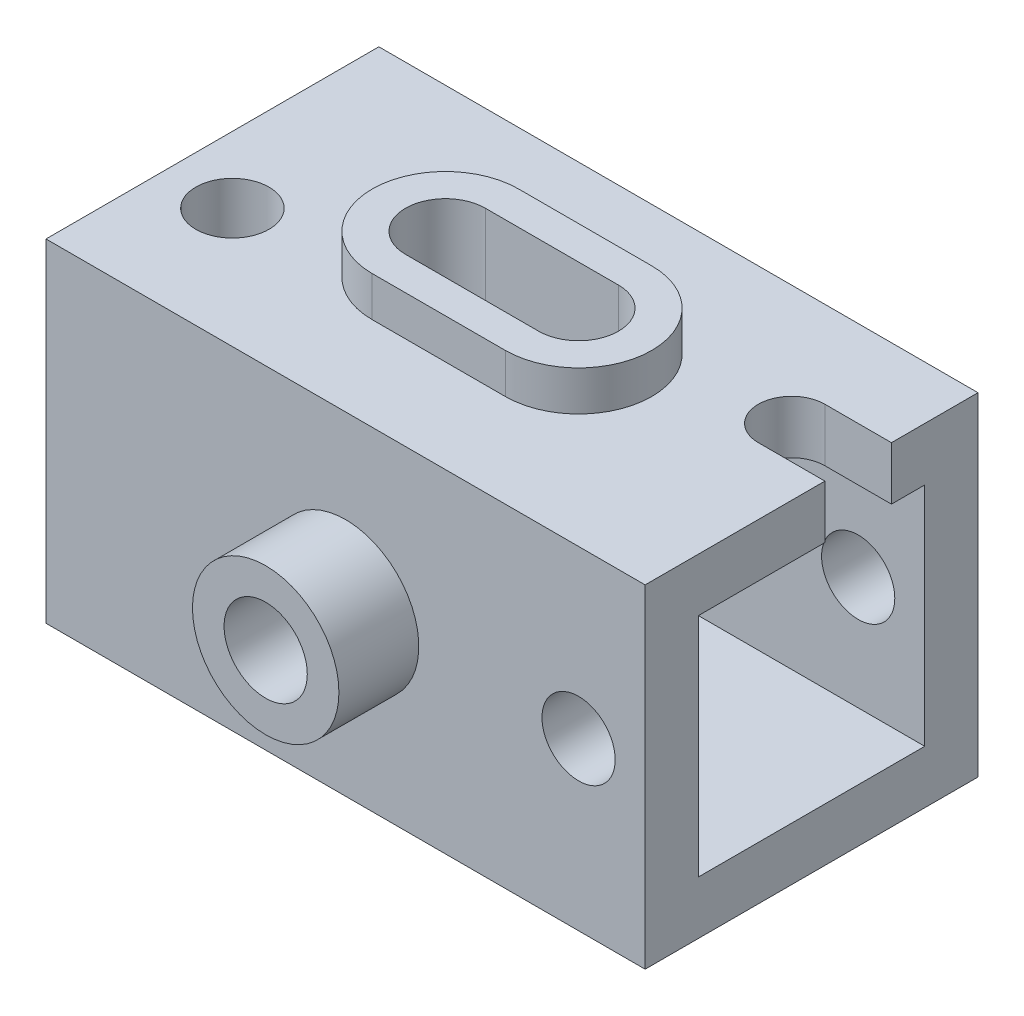
ISO-10303-21;
HEADER;
FILE_DESCRIPTION(('STEP AP214'),'2;1');
FILE_NAME('part.step','',(''),(''),'','','');
FILE_SCHEMA(('AUTOMOTIVE_DESIGN { 1 0 10303 214 1 1 1 1 }'));
ENDSEC;
DATA;
#1=APPLICATION_CONTEXT('core data for automotive mechanical design processes');
#2=APPLICATION_PROTOCOL_DEFINITION('international standard','automotive_design',2000,#1);
#3=PRODUCT_CONTEXT('',#1,'mechanical');
#4=PRODUCT('Part','Part','',(#3));
#5=PRODUCT_RELATED_PRODUCT_CATEGORY('part','',(#4));
#6=PRODUCT_DEFINITION_FORMATION('','',#4);
#7=PRODUCT_DEFINITION_CONTEXT('part definition',#1,'design');
#8=PRODUCT_DEFINITION('design','',#6,#7);
#9=PRODUCT_DEFINITION_SHAPE('','',#8);
#10=(LENGTH_UNIT() NAMED_UNIT(*) SI_UNIT(.MILLI.,.METRE.));
#11=(NAMED_UNIT(*) PLANE_ANGLE_UNIT() SI_UNIT($,.RADIAN.));
#12=(NAMED_UNIT(*) SI_UNIT($,.STERADIAN.) SOLID_ANGLE_UNIT());
#13=UNCERTAINTY_MEASURE_WITH_UNIT(LENGTH_MEASURE(1.E-05),#10,'distance_accuracy_value','');
#14=(GEOMETRIC_REPRESENTATION_CONTEXT(3) GLOBAL_UNCERTAINTY_ASSIGNED_CONTEXT((#13)) GLOBAL_UNIT_ASSIGNED_CONTEXT((#10,
#11,#12)) REPRESENTATION_CONTEXT('',''));
#15=CARTESIAN_POINT('',(0.,0.,0.));
#16=DIRECTION('',(0.,0.,1.));
#17=DIRECTION('',(1.,0.,0.));
#18=AXIS2_PLACEMENT_3D('',#15,#16,#17);
#19=CARTESIAN_POINT('',(45.,25.,-25.));
#20=DIRECTION('',(0.,-1.,0.));
#21=DIRECTION('',(0.,0.,-1.));
#22=AXIS2_PLACEMENT_3D('',#19,#20,#21);
#23=PLANE('',#22);
#24=DIRECTION('',(0.,0.,1.));
#25=VECTOR('',#24,1.);
#26=CARTESIAN_POINT('',(45.,25.,-25.));
#27=LINE('',#26,#25);
#28=CARTESIAN_POINT('',(45.,25.,-1.99999999999992));
#29=VERTEX_POINT('',#28);
#30=CARTESIAN_POINT('',(45.,25.,25.));
#31=VERTEX_POINT('',#30);
#32=EDGE_CURVE('E469',#29,#31,#27,.T.);
#33=ORIENTED_EDGE('',*,*,#32,.F.);
#34=DIRECTION('',(1.,0.,0.));
#35=VECTOR('',#34,1.);
#36=CARTESIAN_POINT('',(35.,25.,-1.99999999999991));
#37=LINE('',#36,#35);
#38=CARTESIAN_POINT('',(35.,25.,-2.));
#39=VERTEX_POINT('',#38);
#40=EDGE_CURVE('E339',#39,#29,#37,.T.);
#41=ORIENTED_EDGE('',*,*,#40,.F.);
#42=CARTESIAN_POINT('',(35.,25.,-6.99999999999999));
#43=DIRECTION('',(0.,1.,0.));
#44=DIRECTION('',(0.,0.,1.));
#45=AXIS2_PLACEMENT_3D('',#42,#43,#44);
#46=CIRCLE('',#45,4.99999999999999);
#47=CARTESIAN_POINT('',(35.,25.,-12.));
#48=VERTEX_POINT('',#47);
#49=EDGE_CURVE('E338',#48,#39,#46,.T.);
#50=ORIENTED_EDGE('',*,*,#49,.F.);
#51=DIRECTION('',(1.,0.,0.));
#52=VECTOR('',#51,1.);
#53=CARTESIAN_POINT('',(35.,25.,-12.));
#54=LINE('',#53,#52);
#55=CARTESIAN_POINT('',(45.,25.,-12.));
#56=VERTEX_POINT('',#55);
#57=EDGE_CURVE('E328',#48,#56,#54,.T.);
#58=ORIENTED_EDGE('',*,*,#57,.T.);
#59=CARTESIAN_POINT('',(45.,25.,-25.));
#60=VERTEX_POINT('',#59);
#61=EDGE_CURVE('E470',#60,#56,#27,.T.);
#62=ORIENTED_EDGE('',*,*,#61,.F.);
#63=DIRECTION('',(-1.,0.,0.));
#64=VECTOR('',#63,1.);
#65=CARTESIAN_POINT('',(45.,25.,-25.));
#66=LINE('',#65,#64);
#67=CARTESIAN_POINT('',(-45.,25.,-25.));
#68=VERTEX_POINT('',#67);
#69=EDGE_CURVE('E482',#60,#68,#66,.T.);
#70=ORIENTED_EDGE('',*,*,#69,.T.);
#71=DIRECTION('',(0.,0.,1.));
#72=VECTOR('',#71,1.);
#73=CARTESIAN_POINT('',(-45.,25.,-25.));
#74=LINE('',#73,#72);
#75=CARTESIAN_POINT('',(-45.,25.,25.));
#76=VERTEX_POINT('',#75);
#77=EDGE_CURVE('E465',#68,#76,#74,.T.);
#78=ORIENTED_EDGE('',*,*,#77,.T.);
#79=DIRECTION('',(-1.,0.,0.));
#80=VECTOR('',#79,1.);
#81=CARTESIAN_POINT('',(45.,25.,25.));
#82=LINE('',#81,#80);
#83=EDGE_CURVE('E472',#31,#76,#82,.T.);
#84=ORIENTED_EDGE('',*,*,#83,.F.);
#85=EDGE_LOOP('',(#33,#41,#50,#58,#62,#70,#78,#84));
#86=FACE_BOUND('',#85,.T.);
#87=CARTESIAN_POINT('',(-10.,25.,0.));
#88=DIRECTION('',(0.,1.,0.));
#89=DIRECTION('',(0.,0.,1.));
#90=AXIS2_PLACEMENT_3D('',#87,#88,#89);
#91=CIRCLE('',#90,11.);
#92=CARTESIAN_POINT('',(-10.,25.,-11.));
#93=VERTEX_POINT('',#92);
#94=CARTESIAN_POINT('',(-10.,25.,11.));
#95=VERTEX_POINT('',#94);
#96=EDGE_CURVE('E410',#93,#95,#91,.T.);
#97=ORIENTED_EDGE('',*,*,#96,.F.);
#98=DIRECTION('',(-1.,0.,0.));
#99=VECTOR('',#98,1.);
#100=CARTESIAN_POINT('',(-10.,25.,-11.));
#101=LINE('',#100,#99);
#102=CARTESIAN_POINT('',(10.,25.,-11.));
#103=VERTEX_POINT('',#102);
#104=EDGE_CURVE('E421',#103,#93,#101,.T.);
#105=ORIENTED_EDGE('',*,*,#104,.F.);
#106=CARTESIAN_POINT('',(10.,25.,0.));
#107=DIRECTION('',(0.,1.,0.));
#108=DIRECTION('',(0.,0.,1.));
#109=AXIS2_PLACEMENT_3D('',#106,#107,#108);
#110=CIRCLE('',#109,11.);
#111=CARTESIAN_POINT('',(10.,25.,11.));
#112=VERTEX_POINT('',#111);
#113=EDGE_CURVE('E433',#112,#103,#110,.T.);
#114=ORIENTED_EDGE('',*,*,#113,.F.);
#115=DIRECTION('',(1.,0.,0.));
#116=VECTOR('',#115,1.);
#117=CARTESIAN_POINT('',(-10.,25.,11.));
#118=LINE('',#117,#116);
#119=EDGE_CURVE('E430',#95,#112,#118,.T.);
#120=ORIENTED_EDGE('',*,*,#119,.F.);
#121=EDGE_LOOP('',(#97,#105,#114,#120));
#122=FACE_BOUND('',#121,.T.);
#123=CARTESIAN_POINT('',(-35.,25.,7.00000000000001));
#124=DIRECTION('',(0.,1.,0.));
#125=DIRECTION('',(0.,0.,1.));
#126=AXIS2_PLACEMENT_3D('',#123,#124,#125);
#127=CIRCLE('',#126,5.49999999999999);
#128=CARTESIAN_POINT('',(-35.,25.,12.5));
#129=VERTEX_POINT('',#128);
#130=EDGE_CURVE('E534',#129,#129,#127,.T.);
#131=ORIENTED_EDGE('',*,*,#130,.F.);
#132=EDGE_LOOP('',(#131));
#133=FACE_BOUND('',#132,.T.);
#134=ADVANCED_FACE('F189',(#86,#122,#133),#23,.F.);
#135=CARTESIAN_POINT('',(45.,-25.,25.));
#136=DIRECTION('',(0.,0.,-1.));
#137=DIRECTION('',(-1.,0.,0.));
#138=AXIS2_PLACEMENT_3D('',#135,#136,#137);
#139=PLANE('',#138);
#140=CARTESIAN_POINT('',(35.,0.,25.));
#141=DIRECTION('',(0.,0.,1.));
#142=DIRECTION('',(1.,0.,0.));
#143=AXIS2_PLACEMENT_3D('',#140,#141,#142);
#144=CIRCLE('',#143,5.49999999999998);
#145=CARTESIAN_POINT('',(40.5,0.,25.));
#146=VERTEX_POINT('',#145);
#147=EDGE_CURVE('E545',#146,#146,#144,.T.);
#148=ORIENTED_EDGE('',*,*,#147,.F.);
#149=EDGE_LOOP('',(#148));
#150=FACE_BOUND('',#149,.T.);
#151=CARTESIAN_POINT('',(0.,0.,25.));
#152=DIRECTION('',(0.,0.,-1.));
#153=DIRECTION('',(-1.,0.,0.));
#154=AXIS2_PLACEMENT_3D('',#151,#152,#153);
#155=CIRCLE('',#154,11.);
#156=CARTESIAN_POINT('',(-11.,0.,25.));
#157=VERTEX_POINT('',#156);
#158=EDGE_CURVE('E456',#157,#157,#155,.F.);
#159=ORIENTED_EDGE('',*,*,#158,.F.);
#160=EDGE_LOOP('',(#159));
#161=FACE_BOUND('',#160,.T.);
#162=DIRECTION('',(0.,-1.,0.));
#163=VECTOR('',#162,1.);
#164=CARTESIAN_POINT('',(-45.,-25.,25.));
#165=LINE('',#164,#163);
#166=CARTESIAN_POINT('',(-45.,-25.,25.));
#167=VERTEX_POINT('',#166);
#168=EDGE_CURVE('E453',#76,#167,#165,.T.);
#169=ORIENTED_EDGE('',*,*,#168,.T.);
#170=DIRECTION('',(-1.,0.,0.));
#171=VECTOR('',#170,1.);
#172=CARTESIAN_POINT('',(45.,-25.,25.));
#173=LINE('',#172,#171);
#174=CARTESIAN_POINT('',(45.,-25.,25.));
#175=VERTEX_POINT('',#174);
#176=EDGE_CURVE('E488',#175,#167,#173,.T.);
#177=ORIENTED_EDGE('',*,*,#176,.F.);
#178=DIRECTION('',(0.,-1.,0.));
#179=VECTOR('',#178,1.);
#180=CARTESIAN_POINT('',(45.,-25.,25.));
#181=LINE('',#180,#179);
#182=EDGE_CURVE('E461',#31,#175,#181,.T.);
#183=ORIENTED_EDGE('',*,*,#182,.F.);
#184=ORIENTED_EDGE('',*,*,#83,.T.);
#185=EDGE_LOOP('',(#169,#177,#183,#184));
#186=FACE_BOUND('',#185,.T.);
#187=ADVANCED_FACE('F191',(#150,#161,#186),#139,.F.);
#188=CARTESIAN_POINT('',(45.,-25.,-25.));
#189=DIRECTION('',(0.,1.,0.));
#190=DIRECTION('',(0.,0.,1.));
#191=AXIS2_PLACEMENT_3D('',#188,#189,#190);
#192=PLANE('',#191);
#193=DIRECTION('',(0.,0.,-1.));
#194=VECTOR('',#193,1.);
#195=CARTESIAN_POINT('',(-45.,-25.,-25.));
#196=LINE('',#195,#194);
#197=CARTESIAN_POINT('',(-45.,-25.,-25.));
#198=VERTEX_POINT('',#197);
#199=EDGE_CURVE('E475',#167,#198,#196,.T.);
#200=ORIENTED_EDGE('',*,*,#199,.T.);
#201=DIRECTION('',(-1.,0.,0.));
#202=VECTOR('',#201,1.);
#203=CARTESIAN_POINT('',(45.,-25.,-25.));
#204=LINE('',#203,#202);
#205=CARTESIAN_POINT('',(45.,-25.,-25.));
#206=VERTEX_POINT('',#205);
#207=EDGE_CURVE('E485',#206,#198,#204,.T.);
#208=ORIENTED_EDGE('',*,*,#207,.F.);
#209=DIRECTION('',(0.,0.,-1.));
#210=VECTOR('',#209,1.);
#211=CARTESIAN_POINT('',(45.,-25.,-25.));
#212=LINE('',#211,#210);
#213=EDGE_CURVE('E464',#175,#206,#212,.T.);
#214=ORIENTED_EDGE('',*,*,#213,.F.);
#215=ORIENTED_EDGE('',*,*,#176,.T.);
#216=EDGE_LOOP('',(#200,#208,#214,#215));
#217=FACE_BOUND('',#216,.T.);
#218=ADVANCED_FACE('F560',(#217),#192,.F.);
#219=CARTESIAN_POINT('',(45.,-25.,-25.));
#220=DIRECTION('',(0.,0.,1.));
#221=DIRECTION('',(1.,0.,0.));
#222=AXIS2_PLACEMENT_3D('',#219,#220,#221);
#223=PLANE('',#222);
#224=CARTESIAN_POINT('',(-32.49026352877,0.,-25.));
#225=DIRECTION('',(0.,0.,-1.));
#226=DIRECTION('',(-1.,0.,0.));
#227=AXIS2_PLACEMENT_3D('',#224,#225,#226);
#228=CIRCLE('',#227,4.5);
#229=CARTESIAN_POINT('',(-36.99026352877,0.,-25.));
#230=VERTEX_POINT('',#229);
#231=EDGE_CURVE('E551',#230,#230,#228,.T.);
#232=ORIENTED_EDGE('',*,*,#231,.F.);
#233=EDGE_LOOP('',(#232));
#234=FACE_BOUND('',#233,.T.);
#235=CARTESIAN_POINT('',(35.,0.,-25.));
#236=DIRECTION('',(0.,0.,1.));
#237=DIRECTION('',(1.,0.,0.));
#238=AXIS2_PLACEMENT_3D('',#235,#236,#237);
#239=CIRCLE('',#238,5.49999999999999);
#240=CARTESIAN_POINT('',(40.5,0.,-25.));
#241=VERTEX_POINT('',#240);
#242=EDGE_CURVE('E539',#241,#241,#239,.T.);
#243=ORIENTED_EDGE('',*,*,#242,.T.);
#244=EDGE_LOOP('',(#243));
#245=FACE_BOUND('',#244,.T.);
#246=CARTESIAN_POINT('',(0.,0.,-25.));
#247=DIRECTION('',(0.,0.,1.));
#248=DIRECTION('',(1.,0.,0.));
#249=AXIS2_PLACEMENT_3D('',#246,#247,#248);
#250=CIRCLE('',#249,11.);
#251=CARTESIAN_POINT('',(11.,0.,-25.));
#252=VERTEX_POINT('',#251);
#253=EDGE_CURVE('E460',#252,#252,#250,.F.);
#254=ORIENTED_EDGE('',*,*,#253,.F.);
#255=EDGE_LOOP('',(#254));
#256=FACE_BOUND('',#255,.T.);
#257=DIRECTION('',(0.,1.,0.));
#258=VECTOR('',#257,1.);
#259=CARTESIAN_POINT('',(-45.,-25.,-25.));
#260=LINE('',#259,#258);
#261=EDGE_CURVE('E477',#198,#68,#260,.T.);
#262=ORIENTED_EDGE('',*,*,#261,.T.);
#263=ORIENTED_EDGE('',*,*,#69,.F.);
#264=DIRECTION('',(0.,1.,0.));
#265=VECTOR('',#264,1.);
#266=CARTESIAN_POINT('',(45.,-25.,-25.));
#267=LINE('',#266,#265);
#268=EDGE_CURVE('E467',#206,#60,#267,.T.);
#269=ORIENTED_EDGE('',*,*,#268,.F.);
#270=ORIENTED_EDGE('',*,*,#207,.T.);
#271=EDGE_LOOP('',(#262,#263,#269,#270));
#272=FACE_BOUND('',#271,.T.);
#273=ADVANCED_FACE('F557',(#234,#245,#256,#272),#223,.F.);
#274=CARTESIAN_POINT('',(45.,0.,0.));
#275=DIRECTION('',(1.,0.,0.));
#276=DIRECTION('',(0.,0.,-1.));
#277=AXIS2_PLACEMENT_3D('',#274,#275,#276);
#278=PLANE('',#277);
#279=DIRECTION('',(0.,-1.,0.));
#280=VECTOR('',#279,1.);
#281=CARTESIAN_POINT('',(45.,0.,-2.));
#282=LINE('',#281,#280);
#283=CARTESIAN_POINT('',(45.,17.,-2.));
#284=VERTEX_POINT('',#283);
#285=EDGE_CURVE('E352',#29,#284,#282,.T.);
#286=ORIENTED_EDGE('',*,*,#285,.F.);
#287=ORIENTED_EDGE('',*,*,#32,.T.);
#288=ORIENTED_EDGE('',*,*,#182,.T.);
#289=ORIENTED_EDGE('',*,*,#213,.T.);
#290=ORIENTED_EDGE('',*,*,#268,.T.);
#291=ORIENTED_EDGE('',*,*,#61,.T.);
#292=DIRECTION('',(0.,1.,0.));
#293=VECTOR('',#292,1.);
#294=CARTESIAN_POINT('',(45.,0.,-12.));
#295=LINE('',#294,#293);
#296=CARTESIAN_POINT('',(45.,17.,-12.));
#297=VERTEX_POINT('',#296);
#298=EDGE_CURVE('E333',#297,#56,#295,.T.);
#299=ORIENTED_EDGE('',*,*,#298,.F.);
#300=DIRECTION('',(0.,0.,1.));
#301=VECTOR('',#300,1.);
#302=CARTESIAN_POINT('',(45.,17.,-17.));
#303=LINE('',#302,#301);
#304=CARTESIAN_POINT('',(45.,17.,-17.));
#305=VERTEX_POINT('',#304);
#306=EDGE_CURVE('E397',#305,#297,#303,.T.);
#307=ORIENTED_EDGE('',*,*,#306,.F.);
#308=DIRECTION('',(0.,1.,0.));
#309=VECTOR('',#308,1.);
#310=CARTESIAN_POINT('',(45.,-17.,-17.));
#311=LINE('',#310,#309);
#312=CARTESIAN_POINT('',(45.,-17.,-17.));
#313=VERTEX_POINT('',#312);
#314=EDGE_CURVE('E387',#313,#305,#311,.T.);
#315=ORIENTED_EDGE('',*,*,#314,.F.);
#316=DIRECTION('',(0.,0.,-1.));
#317=VECTOR('',#316,1.);
#318=CARTESIAN_POINT('',(45.,-17.,17.));
#319=LINE('',#318,#317);
#320=CARTESIAN_POINT('',(45.,-17.,17.));
#321=VERTEX_POINT('',#320);
#322=EDGE_CURVE('E403',#321,#313,#319,.T.);
#323=ORIENTED_EDGE('',*,*,#322,.F.);
#324=DIRECTION('',(0.,-1.,0.));
#325=VECTOR('',#324,1.);
#326=CARTESIAN_POINT('',(45.,17.,17.));
#327=LINE('',#326,#325);
#328=CARTESIAN_POINT('',(45.,17.,17.));
#329=VERTEX_POINT('',#328);
#330=EDGE_CURVE('E400',#329,#321,#327,.T.);
#331=ORIENTED_EDGE('',*,*,#330,.F.);
#332=EDGE_CURVE('E382',#284,#329,#303,.T.);
#333=ORIENTED_EDGE('',*,*,#332,.F.);
#334=EDGE_LOOP('',(#286,#287,#288,#289,#290,#291,#299,#307,#315,#323,#331,#333));
#335=FACE_BOUND('',#334,.T.);
#336=ADVANCED_FACE('F515',(#335),#278,.T.);
#337=CARTESIAN_POINT('',(-45.,0.,0.));
#338=DIRECTION('',(1.,0.,0.));
#339=DIRECTION('',(0.,0.,-1.));
#340=AXIS2_PLACEMENT_3D('',#337,#338,#339);
#341=PLANE('',#340);
#342=DIRECTION('',(0.,1.,0.));
#343=VECTOR('',#342,1.);
#344=CARTESIAN_POINT('',(-45.,-17.,-17.));
#345=LINE('',#344,#343);
#346=CARTESIAN_POINT('',(-45.,-17.,-17.));
#347=VERTEX_POINT('',#346);
#348=CARTESIAN_POINT('',(-45.,17.,-17.));
#349=VERTEX_POINT('',#348);
#350=EDGE_CURVE('E393',#347,#349,#345,.T.);
#351=ORIENTED_EDGE('',*,*,#350,.T.);
#352=DIRECTION('',(0.,0.,1.));
#353=VECTOR('',#352,1.);
#354=CARTESIAN_POINT('',(-45.,17.,-17.));
#355=LINE('',#354,#353);
#356=CARTESIAN_POINT('',(-45.,17.,17.));
#357=VERTEX_POINT('',#356);
#358=EDGE_CURVE('E383',#349,#357,#355,.T.);
#359=ORIENTED_EDGE('',*,*,#358,.T.);
#360=DIRECTION('',(0.,-1.,0.));
#361=VECTOR('',#360,1.);
#362=CARTESIAN_POINT('',(-45.,17.,17.));
#363=LINE('',#362,#361);
#364=CARTESIAN_POINT('',(-45.,-17.,17.));
#365=VERTEX_POINT('',#364);
#366=EDGE_CURVE('E386',#357,#365,#363,.T.);
#367=ORIENTED_EDGE('',*,*,#366,.T.);
#368=DIRECTION('',(0.,0.,-1.));
#369=VECTOR('',#368,1.);
#370=CARTESIAN_POINT('',(-45.,-17.,17.));
#371=LINE('',#370,#369);
#372=EDGE_CURVE('E390',#365,#347,#371,.T.);
#373=ORIENTED_EDGE('',*,*,#372,.T.);
#374=EDGE_LOOP('',(#351,#359,#367,#373));
#375=FACE_BOUND('',#374,.T.);
#376=ORIENTED_EDGE('',*,*,#168,.F.);
#377=ORIENTED_EDGE('',*,*,#77,.F.);
#378=ORIENTED_EDGE('',*,*,#261,.F.);
#379=ORIENTED_EDGE('',*,*,#199,.F.);
#380=EDGE_LOOP('',(#376,#377,#378,#379));
#381=FACE_BOUND('',#380,.T.);
#382=ADVANCED_FACE('F525',(#375,#381),#341,.F.);
#383=CARTESIAN_POINT('',(0.,0.,-37.));
#384=DIRECTION('',(0.,0.,1.));
#385=DIRECTION('',(1.,0.,0.));
#386=AXIS2_PLACEMENT_3D('',#383,#384,#385);
#387=PLANE('',#386);
#388=CARTESIAN_POINT('',(0.,0.,-37.));
#389=DIRECTION('',(0.,0.,1.));
#390=DIRECTION('',(1.,0.,0.));
#391=AXIS2_PLACEMENT_3D('',#388,#389,#390);
#392=CIRCLE('',#391,6.24999999999999);
#393=CARTESIAN_POINT('',(6.24999999999999,0.,-37.));
#394=VERTEX_POINT('',#393);
#395=EDGE_CURVE('E375',#394,#394,#392,.T.);
#396=ORIENTED_EDGE('',*,*,#395,.T.);
#397=EDGE_LOOP('',(#396));
#398=FACE_BOUND('',#397,.T.);
#399=CARTESIAN_POINT('',(0.,0.,-37.));
#400=DIRECTION('',(0.,0.,1.));
#401=DIRECTION('',(1.,0.,0.));
#402=AXIS2_PLACEMENT_3D('',#399,#400,#401);
#403=CIRCLE('',#402,11.);
#404=CARTESIAN_POINT('',(11.,0.,-37.));
#405=VERTEX_POINT('',#404);
#406=EDGE_CURVE('E449',#405,#405,#403,.T.);
#407=ORIENTED_EDGE('',*,*,#406,.F.);
#408=EDGE_LOOP('',(#407));
#409=FACE_BOUND('',#408,.T.);
#410=ADVANCED_FACE('F579',(#398,#409),#387,.F.);
#411=CARTESIAN_POINT('',(0.,0.,37.));
#412=DIRECTION('',(0.,0.,-1.));
#413=DIRECTION('',(-1.,0.,0.));
#414=AXIS2_PLACEMENT_3D('',#411,#412,#413);
#415=CYLINDRICAL_SURFACE('',#414,11.);
#416=ORIENTED_EDGE('',*,*,#406,.T.);
#417=EDGE_LOOP('',(#416));
#418=FACE_BOUND('',#417,.T.);
#419=ORIENTED_EDGE('',*,*,#253,.T.);
#420=EDGE_LOOP('',(#419));
#421=FACE_BOUND('',#420,.T.);
#422=ADVANCED_FACE('F587',(#418,#421),#415,.T.);
#423=CARTESIAN_POINT('',(0.,0.,37.));
#424=DIRECTION('',(0.,0.,1.));
#425=DIRECTION('',(1.,0.,0.));
#426=AXIS2_PLACEMENT_3D('',#423,#424,#425);
#427=CIRCLE('',#426,11.);
#428=CARTESIAN_POINT('',(11.,0.,37.));
#429=VERTEX_POINT('',#428);
#430=EDGE_CURVE('E450',#429,#429,#427,.T.);
#431=ORIENTED_EDGE('',*,*,#430,.F.);
#432=EDGE_LOOP('',(#431));
#433=FACE_BOUND('',#432,.T.);
#434=ORIENTED_EDGE('',*,*,#158,.T.);
#435=EDGE_LOOP('',(#434));
#436=FACE_BOUND('',#435,.T.);
#437=ADVANCED_FACE('F583',(#433,#436),#415,.T.);
#438=CARTESIAN_POINT('',(0.,0.,37.));
#439=DIRECTION('',(0.,0.,1.));
#440=DIRECTION('',(1.,0.,0.));
#441=AXIS2_PLACEMENT_3D('',#438,#439,#440);
#442=PLANE('',#441);
#443=CARTESIAN_POINT('',(0.,0.,37.));
#444=DIRECTION('',(0.,0.,1.));
#445=DIRECTION('',(1.,0.,0.));
#446=AXIS2_PLACEMENT_3D('',#443,#444,#445);
#447=CIRCLE('',#446,6.25);
#448=CARTESIAN_POINT('',(6.25,0.,37.));
#449=VERTEX_POINT('',#448);
#450=EDGE_CURVE('E372',#449,#449,#447,.T.);
#451=ORIENTED_EDGE('',*,*,#450,.F.);
#452=EDGE_LOOP('',(#451));
#453=FACE_BOUND('',#452,.T.);
#454=ORIENTED_EDGE('',*,*,#430,.T.);
#455=EDGE_LOOP('',(#454));
#456=FACE_BOUND('',#455,.T.);
#457=ADVANCED_FACE('F586',(#453,#456),#442,.T.);
#458=CARTESIAN_POINT('',(-10.,31.,0.));
#459=DIRECTION('',(0.,-1.,0.));
#460=DIRECTION('',(0.,0.,-1.));
#461=AXIS2_PLACEMENT_3D('',#458,#459,#460);
#462=CYLINDRICAL_SURFACE('',#461,11.);
#463=ORIENTED_EDGE('',*,*,#96,.T.);
#464=DIRECTION('',(0.,-1.,0.));
#465=VECTOR('',#464,1.);
#466=CARTESIAN_POINT('',(-10.,31.,11.));
#467=LINE('',#466,#465);
#468=CARTESIAN_POINT('',(-10.,31.,11.));
#469=VERTEX_POINT('',#468);
#470=EDGE_CURVE('E446',#469,#95,#467,.T.);
#471=ORIENTED_EDGE('',*,*,#470,.F.);
#472=CARTESIAN_POINT('',(-10.,31.,0.));
#473=DIRECTION('',(0.,1.,0.));
#474=DIRECTION('',(0.,0.,1.));
#475=AXIS2_PLACEMENT_3D('',#472,#473,#474);
#476=CIRCLE('',#475,11.);
#477=CARTESIAN_POINT('',(-10.,31.,-11.));
#478=VERTEX_POINT('',#477);
#479=EDGE_CURVE('E417',#478,#469,#476,.T.);
#480=ORIENTED_EDGE('',*,*,#479,.F.);
#481=DIRECTION('',(0.,-1.,0.));
#482=VECTOR('',#481,1.);
#483=CARTESIAN_POINT('',(-10.,31.,-11.));
#484=LINE('',#483,#482);
#485=EDGE_CURVE('E427',#478,#93,#484,.T.);
#486=ORIENTED_EDGE('',*,*,#485,.T.);
#487=EDGE_LOOP('',(#463,#471,#480,#486));
#488=FACE_BOUND('',#487,.T.);
#489=ADVANCED_FACE('F594',(#488),#462,.T.);
#490=CARTESIAN_POINT('',(-10.,31.,11.));
#491=DIRECTION('',(0.,0.,-1.));
#492=DIRECTION('',(-1.,0.,0.));
#493=AXIS2_PLACEMENT_3D('',#490,#491,#492);
#494=PLANE('',#493);
#495=ORIENTED_EDGE('',*,*,#119,.T.);
#496=DIRECTION('',(0.,-1.,0.));
#497=VECTOR('',#496,1.);
#498=CARTESIAN_POINT('',(10.,31.,11.));
#499=LINE('',#498,#497);
#500=CARTESIAN_POINT('',(10.,31.,11.));
#501=VERTEX_POINT('',#500);
#502=EDGE_CURVE('E443',#501,#112,#499,.T.);
#503=ORIENTED_EDGE('',*,*,#502,.F.);
#504=DIRECTION('',(1.,0.,0.));
#505=VECTOR('',#504,1.);
#506=CARTESIAN_POINT('',(-10.,31.,11.));
#507=LINE('',#506,#505);
#508=EDGE_CURVE('E420',#469,#501,#507,.T.);
#509=ORIENTED_EDGE('',*,*,#508,.F.);
#510=ORIENTED_EDGE('',*,*,#470,.T.);
#511=EDGE_LOOP('',(#495,#503,#509,#510));
#512=FACE_BOUND('',#511,.T.);
#513=ADVANCED_FACE('F598',(#512),#494,.F.);
#514=CARTESIAN_POINT('',(10.,31.,0.));
#515=DIRECTION('',(0.,-1.,0.));
#516=DIRECTION('',(0.,0.,-1.));
#517=AXIS2_PLACEMENT_3D('',#514,#515,#516);
#518=CYLINDRICAL_SURFACE('',#517,11.);
#519=ORIENTED_EDGE('',*,*,#113,.T.);
#520=DIRECTION('',(0.,-1.,0.));
#521=VECTOR('',#520,1.);
#522=CARTESIAN_POINT('',(10.,31.,-11.));
#523=LINE('',#522,#521);
#524=CARTESIAN_POINT('',(10.,31.,-11.));
#525=VERTEX_POINT('',#524);
#526=EDGE_CURVE('E440',#525,#103,#523,.T.);
#527=ORIENTED_EDGE('',*,*,#526,.F.);
#528=CARTESIAN_POINT('',(10.,31.,0.));
#529=DIRECTION('',(0.,1.,0.));
#530=DIRECTION('',(0.,0.,1.));
#531=AXIS2_PLACEMENT_3D('',#528,#529,#530);
#532=CIRCLE('',#531,11.);
#533=EDGE_CURVE('E423',#501,#525,#532,.T.);
#534=ORIENTED_EDGE('',*,*,#533,.F.);
#535=ORIENTED_EDGE('',*,*,#502,.T.);
#536=EDGE_LOOP('',(#519,#527,#534,#535));
#537=FACE_BOUND('',#536,.T.);
#538=ADVANCED_FACE('F602',(#537),#518,.T.);
#539=CARTESIAN_POINT('',(-10.,31.,-11.));
#540=DIRECTION('',(0.,0.,1.));
#541=DIRECTION('',(1.,0.,0.));
#542=AXIS2_PLACEMENT_3D('',#539,#540,#541);
#543=PLANE('',#542);
#544=ORIENTED_EDGE('',*,*,#104,.T.);
#545=ORIENTED_EDGE('',*,*,#485,.F.);
#546=DIRECTION('',(-1.,0.,0.));
#547=VECTOR('',#546,1.);
#548=CARTESIAN_POINT('',(-10.,31.,-11.));
#549=LINE('',#548,#547);
#550=EDGE_CURVE('E425',#525,#478,#549,.T.);
#551=ORIENTED_EDGE('',*,*,#550,.F.);
#552=ORIENTED_EDGE('',*,*,#526,.T.);
#553=EDGE_LOOP('',(#544,#545,#551,#552));
#554=FACE_BOUND('',#553,.T.);
#555=ADVANCED_FACE('F606',(#554),#543,.F.);
#556=CARTESIAN_POINT('',(-10.,31.,0.));
#557=DIRECTION('',(0.,1.,0.));
#558=DIRECTION('',(0.,0.,1.));
#559=AXIS2_PLACEMENT_3D('',#556,#557,#558);
#560=PLANE('',#559);
#561=DIRECTION('',(1.,0.,0.));
#562=VECTOR('',#561,1.);
#563=CARTESIAN_POINT('',(-10.,31.,6.00000000000003));
#564=LINE('',#563,#562);
#565=CARTESIAN_POINT('',(-10.,31.,6.));
#566=VERTEX_POINT('',#565);
#567=CARTESIAN_POINT('',(10.,31.,6.00000000000003));
#568=VERTEX_POINT('',#567);
#569=EDGE_CURVE('E354',#566,#568,#564,.T.);
#570=ORIENTED_EDGE('',*,*,#569,.F.);
#571=CARTESIAN_POINT('',(-10.,31.,0.));
#572=DIRECTION('',(0.,1.,0.));
#573=DIRECTION('',(0.,0.,1.));
#574=AXIS2_PLACEMENT_3D('',#571,#572,#573);
#575=CIRCLE('',#574,6.);
#576=CARTESIAN_POINT('',(-10.,31.,-6.));
#577=VERTEX_POINT('',#576);
#578=EDGE_CURVE('E359',#577,#566,#575,.T.);
#579=ORIENTED_EDGE('',*,*,#578,.F.);
#580=DIRECTION('',(1.,0.,0.));
#581=VECTOR('',#580,1.);
#582=CARTESIAN_POINT('',(-10.,31.,-6.));
#583=LINE('',#582,#581);
#584=CARTESIAN_POINT('',(10.,31.,-6.));
#585=VERTEX_POINT('',#584);
#586=EDGE_CURVE('E356',#577,#585,#583,.T.);
#587=ORIENTED_EDGE('',*,*,#586,.T.);
#588=CARTESIAN_POINT('',(10.,31.,0.));
#589=DIRECTION('',(0.,1.,0.));
#590=DIRECTION('',(0.,0.,1.));
#591=AXIS2_PLACEMENT_3D('',#588,#589,#590);
#592=CIRCLE('',#591,6.);
#593=EDGE_CURVE('E364',#568,#585,#592,.T.);
#594=ORIENTED_EDGE('',*,*,#593,.F.);
#595=EDGE_LOOP('',(#570,#579,#587,#594));
#596=FACE_BOUND('',#595,.T.);
#597=ORIENTED_EDGE('',*,*,#479,.T.);
#598=ORIENTED_EDGE('',*,*,#508,.T.);
#599=ORIENTED_EDGE('',*,*,#533,.T.);
#600=ORIENTED_EDGE('',*,*,#550,.T.);
#601=EDGE_LOOP('',(#597,#598,#599,#600));
#602=FACE_BOUND('',#601,.T.);
#603=ADVANCED_FACE('F610',(#596,#602),#560,.T.);
#604=CARTESIAN_POINT('',(-45.,17.,-17.));
#605=DIRECTION('',(0.,1.,0.));
#606=DIRECTION('',(0.,0.,1.));
#607=AXIS2_PLACEMENT_3D('',#604,#605,#606);
#608=PLANE('',#607);
#609=CARTESIAN_POINT('',(-35.,17.,7.00000000000001));
#610=DIRECTION('',(0.,1.,0.));
#611=DIRECTION('',(0.,0.,1.));
#612=AXIS2_PLACEMENT_3D('',#609,#610,#611);
#613=CIRCLE('',#612,5.49999999999999);
#614=CARTESIAN_POINT('',(-35.,17.,12.5));
#615=VERTEX_POINT('',#614);
#616=EDGE_CURVE('E532',#615,#615,#613,.T.);
#617=ORIENTED_EDGE('',*,*,#616,.T.);
#618=EDGE_LOOP('',(#617));
#619=FACE_BOUND('',#618,.T.);
#620=CARTESIAN_POINT('',(10.,17.,0.));
#621=DIRECTION('',(0.,1.,0.));
#622=DIRECTION('',(0.,0.,1.));
#623=AXIS2_PLACEMENT_3D('',#620,#621,#622);
#624=CIRCLE('',#623,6.);
#625=CARTESIAN_POINT('',(10.,17.,6.));
#626=VERTEX_POINT('',#625);
#627=CARTESIAN_POINT('',(10.,17.,-6.));
#628=VERTEX_POINT('',#627);
#629=EDGE_CURVE('E500',#626,#628,#624,.T.);
#630=ORIENTED_EDGE('',*,*,#629,.T.);
#631=DIRECTION('',(-1.,0.,0.));
#632=VECTOR('',#631,1.);
#633=CARTESIAN_POINT('',(-45.,17.,-6.));
#634=LINE('',#633,#632);
#635=CARTESIAN_POINT('',(-10.,17.,-6.));
#636=VERTEX_POINT('',#635);
#637=EDGE_CURVE('E503',#628,#636,#634,.T.);
#638=ORIENTED_EDGE('',*,*,#637,.T.);
#639=CARTESIAN_POINT('',(-10.,17.,0.));
#640=DIRECTION('',(0.,1.,0.));
#641=DIRECTION('',(0.,0.,1.));
#642=AXIS2_PLACEMENT_3D('',#639,#640,#641);
#643=CIRCLE('',#642,6.);
#644=CARTESIAN_POINT('',(-9.99999999999999,17.,6.));
#645=VERTEX_POINT('',#644);
#646=EDGE_CURVE('E497',#636,#645,#643,.T.);
#647=ORIENTED_EDGE('',*,*,#646,.T.);
#648=DIRECTION('',(1.,0.,0.));
#649=VECTOR('',#648,1.);
#650=CARTESIAN_POINT('',(-45.,17.,6.));
#651=LINE('',#650,#649);
#652=EDGE_CURVE('E459',#645,#626,#651,.T.);
#653=ORIENTED_EDGE('',*,*,#652,.T.);
#654=EDGE_LOOP('',(#630,#638,#647,#653));
#655=FACE_BOUND('',#654,.T.);
#656=ORIENTED_EDGE('',*,*,#306,.T.);
#657=DIRECTION('',(-1.,0.,0.));
#658=VECTOR('',#657,1.);
#659=CARTESIAN_POINT('',(-45.,17.,-12.));
#660=LINE('',#659,#658);
#661=CARTESIAN_POINT('',(35.,17.,-12.));
#662=VERTEX_POINT('',#661);
#663=EDGE_CURVE('E13',#297,#662,#660,.T.);
#664=ORIENTED_EDGE('',*,*,#663,.T.);
#665=CARTESIAN_POINT('',(35.,17.,-6.99999999999999));
#666=DIRECTION('',(0.,1.,0.));
#667=DIRECTION('',(0.,0.,1.));
#668=AXIS2_PLACEMENT_3D('',#665,#666,#667);
#669=CIRCLE('',#668,4.99999999999999);
#670=CARTESIAN_POINT('',(35.,17.,-2.));
#671=VERTEX_POINT('',#670);
#672=EDGE_CURVE('E198',#662,#671,#669,.T.);
#673=ORIENTED_EDGE('',*,*,#672,.T.);
#674=DIRECTION('',(1.,0.,0.));
#675=VECTOR('',#674,1.);
#676=CARTESIAN_POINT('',(-45.,17.,-1.99999999999999));
#677=LINE('',#676,#675);
#678=EDGE_CURVE('E506',#671,#284,#677,.T.);
#679=ORIENTED_EDGE('',*,*,#678,.T.);
#680=ORIENTED_EDGE('',*,*,#332,.T.);
#681=DIRECTION('',(1.,0.,0.));
#682=VECTOR('',#681,1.);
#683=CARTESIAN_POINT('',(-45.,17.,17.));
#684=LINE('',#683,#682);
#685=EDGE_CURVE('E396',#357,#329,#684,.T.);
#686=ORIENTED_EDGE('',*,*,#685,.F.);
#687=ORIENTED_EDGE('',*,*,#358,.F.);
#688=DIRECTION('',(1.,0.,0.));
#689=VECTOR('',#688,1.);
#690=CARTESIAN_POINT('',(-45.,17.,-17.));
#691=LINE('',#690,#689);
#692=EDGE_CURVE('E408',#349,#305,#691,.T.);
#693=ORIENTED_EDGE('',*,*,#692,.T.);
#694=EDGE_LOOP('',(#656,#664,#673,#679,#680,#686,#687,#693));
#695=FACE_BOUND('',#694,.T.);
#696=ADVANCED_FACE('F510',(#619,#655,#695),#608,.F.);
#697=CARTESIAN_POINT('',(-45.,-17.,-17.));
#698=DIRECTION('',(0.,0.,-1.));
#699=DIRECTION('',(-1.,0.,0.));
#700=AXIS2_PLACEMENT_3D('',#697,#698,#699);
#701=PLANE('',#700);
#702=CARTESIAN_POINT('',(-32.49026352877,0.,-17.));
#703=DIRECTION('',(0.,0.,-1.));
#704=DIRECTION('',(-1.,0.,0.));
#705=AXIS2_PLACEMENT_3D('',#702,#703,#704);
#706=CIRCLE('',#705,4.5);
#707=CARTESIAN_POINT('',(-36.99026352877,0.,-17.));
#708=VERTEX_POINT('',#707);
#709=EDGE_CURVE('E548',#708,#708,#706,.T.);
#710=ORIENTED_EDGE('',*,*,#709,.T.);
#711=EDGE_LOOP('',(#710));
#712=FACE_BOUND('',#711,.T.);
#713=CARTESIAN_POINT('',(35.,0.,-17.));
#714=DIRECTION('',(0.,0.,-1.));
#715=DIRECTION('',(-1.,0.,0.));
#716=AXIS2_PLACEMENT_3D('',#713,#714,#715);
#717=CIRCLE('',#716,5.49999999999999);
#718=CARTESIAN_POINT('',(40.5,0.,-17.));
#719=VERTEX_POINT('',#718);
#720=EDGE_CURVE('E542',#719,#719,#717,.T.);
#721=ORIENTED_EDGE('',*,*,#720,.T.);
#722=EDGE_LOOP('',(#721));
#723=FACE_BOUND('',#722,.T.);
#724=CARTESIAN_POINT('',(0.,0.,-17.));
#725=DIRECTION('',(0.,0.,-1.));
#726=DIRECTION('',(-1.,0.,0.));
#727=AXIS2_PLACEMENT_3D('',#724,#725,#726);
#728=CIRCLE('',#727,6.25);
#729=CARTESIAN_POINT('',(-6.25,0.,-17.));
#730=VERTEX_POINT('',#729);
#731=EDGE_CURVE('E379',#730,#730,#728,.T.);
#732=ORIENTED_EDGE('',*,*,#731,.T.);
#733=EDGE_LOOP('',(#732));
#734=FACE_BOUND('',#733,.T.);
#735=ORIENTED_EDGE('',*,*,#314,.T.);
#736=ORIENTED_EDGE('',*,*,#692,.F.);
#737=ORIENTED_EDGE('',*,*,#350,.F.);
#738=DIRECTION('',(1.,0.,0.));
#739=VECTOR('',#738,1.);
#740=CARTESIAN_POINT('',(-45.,-17.,-17.));
#741=LINE('',#740,#739);
#742=EDGE_CURVE('E411',#347,#313,#741,.T.);
#743=ORIENTED_EDGE('',*,*,#742,.T.);
#744=EDGE_LOOP('',(#735,#736,#737,#743));
#745=FACE_BOUND('',#744,.T.);
#746=ADVANCED_FACE('F617',(#712,#723,#734,#745),#701,.F.);
#747=CARTESIAN_POINT('',(-45.,-17.,17.));
#748=DIRECTION('',(0.,-1.,0.));
#749=DIRECTION('',(0.,0.,-1.));
#750=AXIS2_PLACEMENT_3D('',#747,#748,#749);
#751=PLANE('',#750);
#752=ORIENTED_EDGE('',*,*,#322,.T.);
#753=ORIENTED_EDGE('',*,*,#742,.F.);
#754=ORIENTED_EDGE('',*,*,#372,.F.);
#755=DIRECTION('',(1.,0.,0.));
#756=VECTOR('',#755,1.);
#757=CARTESIAN_POINT('',(-45.,-17.,17.));
#758=LINE('',#757,#756);
#759=EDGE_CURVE('E413',#365,#321,#758,.T.);
#760=ORIENTED_EDGE('',*,*,#759,.T.);
#761=EDGE_LOOP('',(#752,#753,#754,#760));
#762=FACE_BOUND('',#761,.T.);
#763=ADVANCED_FACE('F623',(#762),#751,.F.);
#764=CARTESIAN_POINT('',(-45.,17.,17.));
#765=DIRECTION('',(0.,0.,1.));
#766=DIRECTION('',(1.,0.,0.));
#767=AXIS2_PLACEMENT_3D('',#764,#765,#766);
#768=PLANE('',#767);
#769=CARTESIAN_POINT('',(35.,0.,17.));
#770=DIRECTION('',(0.,0.,1.));
#771=DIRECTION('',(1.,0.,0.));
#772=AXIS2_PLACEMENT_3D('',#769,#770,#771);
#773=CIRCLE('',#772,5.49999999999999);
#774=CARTESIAN_POINT('',(40.5,0.,17.));
#775=VERTEX_POINT('',#774);
#776=EDGE_CURVE('E193',#775,#775,#773,.T.);
#777=ORIENTED_EDGE('',*,*,#776,.T.);
#778=EDGE_LOOP('',(#777));
#779=FACE_BOUND('',#778,.T.);
#780=CARTESIAN_POINT('',(0.,0.,17.));
#781=DIRECTION('',(0.,0.,1.));
#782=DIRECTION('',(1.,0.,0.));
#783=AXIS2_PLACEMENT_3D('',#780,#781,#782);
#784=CIRCLE('',#783,6.25);
#785=CARTESIAN_POINT('',(6.25,0.,17.));
#786=VERTEX_POINT('',#785);
#787=EDGE_CURVE('E378',#786,#786,#784,.T.);
#788=ORIENTED_EDGE('',*,*,#787,.T.);
#789=EDGE_LOOP('',(#788));
#790=FACE_BOUND('',#789,.T.);
#791=ORIENTED_EDGE('',*,*,#330,.T.);
#792=ORIENTED_EDGE('',*,*,#759,.F.);
#793=ORIENTED_EDGE('',*,*,#366,.F.);
#794=ORIENTED_EDGE('',*,*,#685,.T.);
#795=EDGE_LOOP('',(#791,#792,#793,#794));
#796=FACE_BOUND('',#795,.T.);
#797=ADVANCED_FACE('F619',(#779,#790,#796),#768,.F.);
#798=CARTESIAN_POINT('',(0.,0.,37.));
#799=DIRECTION('',(0.,0.,1.));
#800=DIRECTION('',(1.,0.,0.));
#801=AXIS2_PLACEMENT_3D('',#798,#799,#800);
#802=CYLINDRICAL_SURFACE('',#801,6.25);
#803=ORIENTED_EDGE('',*,*,#450,.T.);
#804=EDGE_LOOP('',(#803));
#805=FACE_BOUND('',#804,.T.);
#806=ORIENTED_EDGE('',*,*,#787,.F.);
#807=EDGE_LOOP('',(#806));
#808=FACE_BOUND('',#807,.T.);
#809=ADVANCED_FACE('F622',(#805,#808),#802,.F.);
#810=ORIENTED_EDGE('',*,*,#395,.F.);
#811=EDGE_LOOP('',(#810));
#812=FACE_BOUND('',#811,.T.);
#813=ORIENTED_EDGE('',*,*,#731,.F.);
#814=EDGE_LOOP('',(#813));
#815=FACE_BOUND('',#814,.T.);
#816=ADVANCED_FACE('F631',(#812,#815),#802,.F.);
#817=CARTESIAN_POINT('',(10.,31.,0.));
#818=DIRECTION('',(0.,1.,0.));
#819=DIRECTION('',(0.,0.,1.));
#820=AXIS2_PLACEMENT_3D('',#817,#818,#819);
#821=CYLINDRICAL_SURFACE('',#820,6.);
#822=DIRECTION('',(0.,1.,0.));
#823=VECTOR('',#822,1.);
#824=CARTESIAN_POINT('',(10.,31.,6.));
#825=LINE('',#824,#823);
#826=EDGE_CURVE('E369',#568,#626,#825,.F.);
#827=ORIENTED_EDGE('',*,*,#826,.F.);
#828=ORIENTED_EDGE('',*,*,#593,.T.);
#829=DIRECTION('',(0.,1.,0.));
#830=VECTOR('',#829,1.);
#831=CARTESIAN_POINT('',(10.,31.,-6.));
#832=LINE('',#831,#830);
#833=EDGE_CURVE('E367',#628,#585,#832,.T.);
#834=ORIENTED_EDGE('',*,*,#833,.F.);
#835=ORIENTED_EDGE('',*,*,#629,.F.);
#836=EDGE_LOOP('',(#827,#828,#834,#835));
#837=FACE_BOUND('',#836,.T.);
#838=ADVANCED_FACE('F634',(#837),#821,.F.);
#839=CARTESIAN_POINT('',(-10.,31.,0.));
#840=DIRECTION('',(0.,1.,0.));
#841=DIRECTION('',(0.,0.,1.));
#842=AXIS2_PLACEMENT_3D('',#839,#840,#841);
#843=CYLINDRICAL_SURFACE('',#842,6.);
#844=DIRECTION('',(0.,1.,0.));
#845=VECTOR('',#844,1.);
#846=CARTESIAN_POINT('',(-10.,31.,-6.));
#847=LINE('',#846,#845);
#848=EDGE_CURVE('E213',#577,#636,#847,.F.);
#849=ORIENTED_EDGE('',*,*,#848,.F.);
#850=ORIENTED_EDGE('',*,*,#578,.T.);
#851=DIRECTION('',(0.,1.,0.));
#852=VECTOR('',#851,1.);
#853=CARTESIAN_POINT('',(-10.,31.,6.));
#854=LINE('',#853,#852);
#855=EDGE_CURVE('E361',#645,#566,#854,.T.);
#856=ORIENTED_EDGE('',*,*,#855,.F.);
#857=ORIENTED_EDGE('',*,*,#646,.F.);
#858=EDGE_LOOP('',(#849,#850,#856,#857));
#859=FACE_BOUND('',#858,.T.);
#860=ADVANCED_FACE('F638',(#859),#843,.F.);
#861=CARTESIAN_POINT('',(-10.,31.,-6.));
#862=DIRECTION('',(0.,0.,-1.));
#863=DIRECTION('',(-1.,0.,0.));
#864=AXIS2_PLACEMENT_3D('',#861,#862,#863);
#865=PLANE('',#864);
#866=ORIENTED_EDGE('',*,*,#833,.T.);
#867=ORIENTED_EDGE('',*,*,#586,.F.);
#868=ORIENTED_EDGE('',*,*,#848,.T.);
#869=ORIENTED_EDGE('',*,*,#637,.F.);
#870=EDGE_LOOP('',(#866,#867,#868,#869));
#871=FACE_BOUND('',#870,.T.);
#872=ADVANCED_FACE('F642',(#871),#865,.F.);
#873=CARTESIAN_POINT('',(-10.,31.,6.));
#874=DIRECTION('',(0.,0.,1.));
#875=DIRECTION('',(1.,0.,0.));
#876=AXIS2_PLACEMENT_3D('',#873,#874,#875);
#877=PLANE('',#876);
#878=ORIENTED_EDGE('',*,*,#855,.T.);
#879=ORIENTED_EDGE('',*,*,#569,.T.);
#880=ORIENTED_EDGE('',*,*,#826,.T.);
#881=ORIENTED_EDGE('',*,*,#652,.F.);
#882=EDGE_LOOP('',(#878,#879,#880,#881));
#883=FACE_BOUND('',#882,.T.);
#884=ADVANCED_FACE('F645',(#883),#877,.F.);
#885=CARTESIAN_POINT('',(35.,25.,-2.));
#886=DIRECTION('',(0.,0.,1.));
#887=DIRECTION('',(1.,0.,0.));
#888=AXIS2_PLACEMENT_3D('',#885,#886,#887);
#889=PLANE('',#888);
#890=ORIENTED_EDGE('',*,*,#285,.T.);
#891=ORIENTED_EDGE('',*,*,#678,.F.);
#892=DIRECTION('',(0.,1.,0.));
#893=VECTOR('',#892,1.);
#894=CARTESIAN_POINT('',(35.,25.,-2.));
#895=LINE('',#894,#893);
#896=EDGE_CURVE('E205',#671,#39,#895,.T.);
#897=ORIENTED_EDGE('',*,*,#896,.T.);
#898=ORIENTED_EDGE('',*,*,#40,.T.);
#899=EDGE_LOOP('',(#890,#891,#897,#898));
#900=FACE_BOUND('',#899,.T.);
#901=ADVANCED_FACE('F531',(#900),#889,.F.);
#902=CARTESIAN_POINT('',(35.,25.,-12.));
#903=DIRECTION('',(0.,0.,-1.));
#904=DIRECTION('',(-1.,0.,0.));
#905=AXIS2_PLACEMENT_3D('',#902,#903,#904);
#906=PLANE('',#905);
#907=ORIENTED_EDGE('',*,*,#298,.T.);
#908=ORIENTED_EDGE('',*,*,#57,.F.);
#909=DIRECTION('',(0.,1.,0.));
#910=VECTOR('',#909,1.);
#911=CARTESIAN_POINT('',(35.,25.,-12.));
#912=LINE('',#911,#910);
#913=EDGE_CURVE('E331',#48,#662,#912,.F.);
#914=ORIENTED_EDGE('',*,*,#913,.T.);
#915=ORIENTED_EDGE('',*,*,#663,.F.);
#916=EDGE_LOOP('',(#907,#908,#914,#915));
#917=FACE_BOUND('',#916,.T.);
#918=ADVANCED_FACE('F330',(#917),#906,.F.);
#919=CARTESIAN_POINT('',(35.,25.,-6.99999999999999));
#920=DIRECTION('',(0.,1.,0.));
#921=DIRECTION('',(0.,0.,1.));
#922=AXIS2_PLACEMENT_3D('',#919,#920,#921);
#923=CYLINDRICAL_SURFACE('',#922,4.99999999999999);
#924=ORIENTED_EDGE('',*,*,#913,.F.);
#925=ORIENTED_EDGE('',*,*,#49,.T.);
#926=ORIENTED_EDGE('',*,*,#896,.F.);
#927=ORIENTED_EDGE('',*,*,#672,.F.);
#928=EDGE_LOOP('',(#924,#925,#926,#927));
#929=FACE_BOUND('',#928,.T.);
#930=ADVANCED_FACE('F341',(#929),#923,.F.);
#931=CARTESIAN_POINT('',(-35.,25.,7.00000000000001));
#932=DIRECTION('',(0.,1.,0.));
#933=DIRECTION('',(0.,0.,1.));
#934=AXIS2_PLACEMENT_3D('',#931,#932,#933);
#935=CYLINDRICAL_SURFACE('',#934,5.49999999999999);
#936=ORIENTED_EDGE('',*,*,#616,.F.);
#937=EDGE_LOOP('',(#936));
#938=FACE_BOUND('',#937,.T.);
#939=ORIENTED_EDGE('',*,*,#130,.T.);
#940=EDGE_LOOP('',(#939));
#941=FACE_BOUND('',#940,.T.);
#942=ADVANCED_FACE('F652',(#938,#941),#935,.F.);
#943=CARTESIAN_POINT('',(35.,0.,25.));
#944=DIRECTION('',(0.,0.,1.));
#945=DIRECTION('',(1.,0.,0.));
#946=AXIS2_PLACEMENT_3D('',#943,#944,#945);
#947=CYLINDRICAL_SURFACE('',#946,5.49999999999999);
#948=ORIENTED_EDGE('',*,*,#147,.T.);
#949=EDGE_LOOP('',(#948));
#950=FACE_BOUND('',#949,.T.);
#951=ORIENTED_EDGE('',*,*,#776,.F.);
#952=EDGE_LOOP('',(#951));
#953=FACE_BOUND('',#952,.T.);
#954=ADVANCED_FACE('F659',(#950,#953),#947,.F.);
#955=CARTESIAN_POINT('',(40.5,0.,-17.));
#956=CARTESIAN_POINT('',(40.5,0.,-17.0833333333333));
#957=CARTESIAN_POINT('',(40.5,0.,-17.1666666666667));
#958=CARTESIAN_POINT('',(40.5,0.,-17.3333333333333));
#959=CARTESIAN_POINT('',(40.5,0.,-17.4166666666667));
#960=CARTESIAN_POINT('',(40.5,0.,-17.5833333333333));
#961=CARTESIAN_POINT('',(40.5,0.,-17.6666666666667));
#962=CARTESIAN_POINT('',(40.5,0.,-17.8333333333333));
#963=CARTESIAN_POINT('',(40.5,0.,-17.9166666666667));
#964=CARTESIAN_POINT('',(40.5,0.,-18.0833333333333));
#965=CARTESIAN_POINT('',(40.5,0.,-18.1666666666667));
#966=CARTESIAN_POINT('',(40.5,0.,-18.3333333333333));
#967=CARTESIAN_POINT('',(40.5,0.,-18.4166666666667));
#968=CARTESIAN_POINT('',(40.5,0.,-18.5833333333333));
#969=CARTESIAN_POINT('',(40.5,0.,-18.6666666666667));
#970=CARTESIAN_POINT('',(40.5,0.,-18.8333333333333));
#971=CARTESIAN_POINT('',(40.5,0.,-18.9166666666667));
#972=CARTESIAN_POINT('',(40.5,0.,-19.0833333333333));
#973=CARTESIAN_POINT('',(40.5,0.,-19.1666666666667));
#974=CARTESIAN_POINT('',(40.5,0.,-19.3333333333333));
#975=CARTESIAN_POINT('',(40.5,0.,-19.4166666666667));
#976=CARTESIAN_POINT('',(40.5,0.,-19.5833333333333));
#977=CARTESIAN_POINT('',(40.5,0.,-19.6666666666667));
#978=CARTESIAN_POINT('',(40.5,0.,-19.8333333333333));
#979=CARTESIAN_POINT('',(40.5,0.,-19.9166666666667));
#980=CARTESIAN_POINT('',(40.5,0.,-20.0833333333333));
#981=CARTESIAN_POINT('',(40.5,0.,-20.1666666666667));
#982=CARTESIAN_POINT('',(40.5,0.,-20.3333333333333));
#983=CARTESIAN_POINT('',(40.5,0.,-20.4166666666667));
#984=CARTESIAN_POINT('',(40.5,0.,-20.5833333333333));
#985=CARTESIAN_POINT('',(40.5,0.,-20.6666666666667));
#986=CARTESIAN_POINT('',(40.5,0.,-20.8333333333333));
#987=CARTESIAN_POINT('',(40.5,0.,-20.9166666666667));
#988=CARTESIAN_POINT('',(40.5,0.,-21.0833333333333));
#989=CARTESIAN_POINT('',(40.5,0.,-21.1666666666667));
#990=CARTESIAN_POINT('',(40.5,0.,-21.3333333333333));
#991=CARTESIAN_POINT('',(40.5,0.,-21.4166666666667));
#992=CARTESIAN_POINT('',(40.5,0.,-21.5833333333333));
#993=CARTESIAN_POINT('',(40.5,0.,-21.6666666666667));
#994=CARTESIAN_POINT('',(40.5,0.,-21.8333333333333));
#995=CARTESIAN_POINT('',(40.5,0.,-21.9166666666667));
#996=CARTESIAN_POINT('',(40.5,0.,-22.0833333333333));
#997=CARTESIAN_POINT('',(40.5,0.,-22.1666666666667));
#998=CARTESIAN_POINT('',(40.5,0.,-22.3333333333333));
#999=CARTESIAN_POINT('',(40.5,0.,-22.4166666666667));
#1000=CARTESIAN_POINT('',(40.5,0.,-22.5833333333333));
#1001=CARTESIAN_POINT('',(40.5,0.,-22.6666666666667));
#1002=CARTESIAN_POINT('',(40.5,0.,-22.8333333333333));
#1003=CARTESIAN_POINT('',(40.5,0.,-22.9166666666667));
#1004=CARTESIAN_POINT('',(40.5,0.,-23.0833333333333));
#1005=CARTESIAN_POINT('',(40.5,0.,-23.1666666666667));
#1006=CARTESIAN_POINT('',(40.5,0.,-23.3333333333333));
#1007=CARTESIAN_POINT('',(40.5,0.,-23.4166666666667));
#1008=CARTESIAN_POINT('',(40.5,0.,-23.5833333333333));
#1009=CARTESIAN_POINT('',(40.5,0.,-23.6666666666667));
#1010=CARTESIAN_POINT('',(40.5,0.,-23.8333333333333));
#1011=CARTESIAN_POINT('',(40.5,0.,-23.9166666666667));
#1012=CARTESIAN_POINT('',(40.5,0.,-24.0833333333333));
#1013=CARTESIAN_POINT('',(40.5,0.,-24.1666666666667));
#1014=CARTESIAN_POINT('',(40.5,0.,-24.3333333333333));
#1015=CARTESIAN_POINT('',(40.5,0.,-24.4166666666667));
#1016=CARTESIAN_POINT('',(40.5,0.,-24.5833333333333));
#1017=CARTESIAN_POINT('',(40.5,0.,-24.6666666666667));
#1018=CARTESIAN_POINT('',(40.5,0.,-24.8333333333333));
#1019=CARTESIAN_POINT('',(40.5,0.,-24.9166666666667));
#1020=CARTESIAN_POINT('',(40.5,0.,-25.));
#1021=B_SPLINE_CURVE_WITH_KNOTS('',3,(#955,#956,#957,#958,#959,#960,#961,#962,#963,#964,#965,
#966,#967,#968,#969,#970,#971,#972,#973,#974,#975,#976,#977,#978,#979,#980,#981,#982,#983,#984,
#985,#986,#987,#988,#989,#990,#991,#992,#993,#994,#995,#996,#997,#998,#999,#1000,#1001,#1002,
#1003,#1004,#1005,#1006,#1007,#1008,#1009,#1010,#1011,#1012,#1013,#1014,#1015,#1016,#1017,#1018,
#1019,#1020),.UNSPECIFIED.,.F.,.F.,(4,2,2,2,2,2,2,2,2,2,2,2,2,2,2,2,2,2,2,2,2,2,2,2,2,2,2,2,2,2,
2,2,4),(0.,0.25,0.5,0.750000000000001,1.,1.25,1.5,1.75,2.,2.25,2.5,2.75,3.,3.25,3.5,3.75,4.,
4.25,4.5,4.75,5.,5.25,5.50000000000001,5.75000000000001,6.00000000000001,6.25000000000001,
6.50000000000001,6.75000000000001,7.00000000000001,7.25000000000001,7.50000000000001,
7.75000000000001,8.00000000000001),.UNSPECIFIED.);
#1022=EDGE_CURVE('BSEAM661',#719,#241,#1021,.T.);
#1023=ORIENTED_EDGE('',*,*,#720,.F.);
#1024=ORIENTED_EDGE('',*,*,#242,.F.);
#1025=ORIENTED_EDGE('',*,*,#1022,.T.);
#1026=ORIENTED_EDGE('',*,*,#1022,.F.);
#1027=EDGE_LOOP('',(#1023,#1025,#1024,#1026));
#1028=FACE_BOUND('',#1027,.T.);
#1029=ADVANCED_FACE('F661',(#1028),#947,.F.);
#1030=CARTESIAN_POINT('',(-32.49026352877,0.,-25.));
#1031=DIRECTION('',(0.,0.,-1.));
#1032=DIRECTION('',(-1.,0.,0.));
#1033=AXIS2_PLACEMENT_3D('',#1030,#1031,#1032);
#1034=CYLINDRICAL_SURFACE('',#1033,4.5);
#1035=ORIENTED_EDGE('',*,*,#709,.F.);
#1036=EDGE_LOOP('',(#1035));
#1037=FACE_BOUND('',#1036,.T.);
#1038=ORIENTED_EDGE('',*,*,#231,.T.);
#1039=EDGE_LOOP('',(#1038));
#1040=FACE_BOUND('',#1039,.T.);
#1041=ADVANCED_FACE('F555',(#1037,#1040),#1034,.F.);
#1042=CLOSED_SHELL('',(#134,#187,#218,#273,#336,#382,#410,#422,#437,#457,#489,#513,#538,#555,
#603,#696,#746,#763,#797,#809,#816,#838,#860,#872,#884,#901,#918,#930,#942,#954,#1029,#1041));
#1043=MANIFOLD_SOLID_BREP('B2',#1042);
#1044=ADVANCED_BREP_SHAPE_REPRESENTATION('',(#18,#1043),#14);
#1045=SHAPE_DEFINITION_REPRESENTATION(#9,#1044);
ENDSEC;
END-ISO-10303-21;
